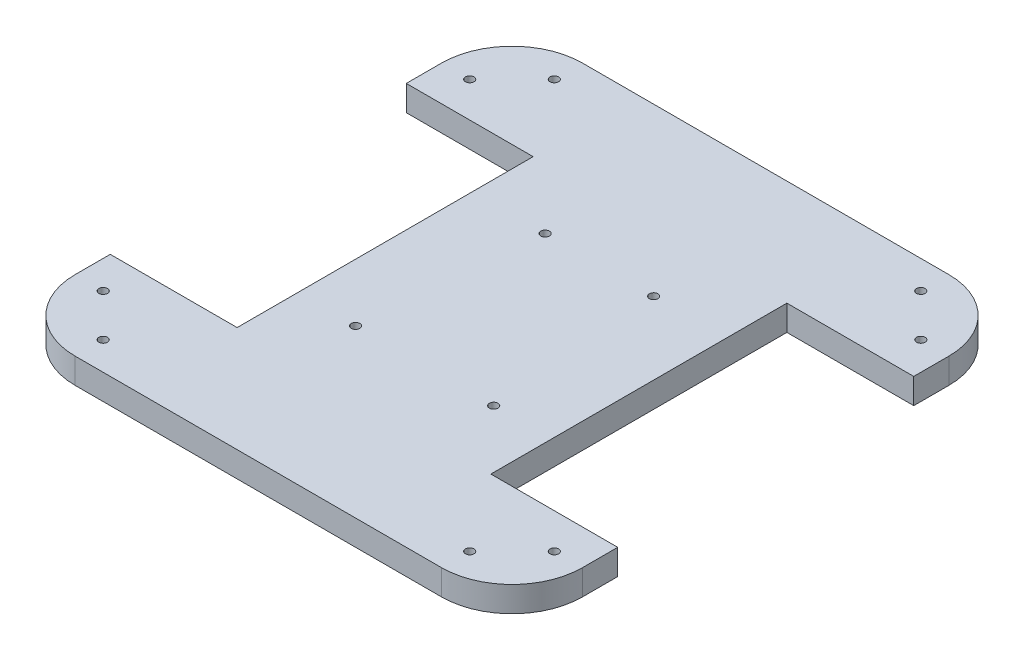
ISO-10303-21;
HEADER;
FILE_DESCRIPTION(('STEP AP214'),'2;1');
FILE_NAME('part.step','',(''),(''),'','','');
FILE_SCHEMA(('AUTOMOTIVE_DESIGN { 1 0 10303 214 1 1 1 1 }'));
ENDSEC;
DATA;
#1=APPLICATION_CONTEXT('core data for automotive mechanical design processes');
#2=APPLICATION_PROTOCOL_DEFINITION('international standard','automotive_design',2000,#1);
#3=PRODUCT_CONTEXT('',#1,'mechanical');
#4=PRODUCT('Part','Part','',(#3));
#5=PRODUCT_RELATED_PRODUCT_CATEGORY('part','',(#4));
#6=PRODUCT_DEFINITION_FORMATION('','',#4);
#7=PRODUCT_DEFINITION_CONTEXT('part definition',#1,'design');
#8=PRODUCT_DEFINITION('design','',#6,#7);
#9=PRODUCT_DEFINITION_SHAPE('','',#8);
#10=(LENGTH_UNIT() NAMED_UNIT(*) SI_UNIT(.MILLI.,.METRE.));
#11=(NAMED_UNIT(*) PLANE_ANGLE_UNIT() SI_UNIT($,.RADIAN.));
#12=(NAMED_UNIT(*) SI_UNIT($,.STERADIAN.) SOLID_ANGLE_UNIT());
#13=UNCERTAINTY_MEASURE_WITH_UNIT(LENGTH_MEASURE(1.E-05),#10,'distance_accuracy_value','');
#14=(GEOMETRIC_REPRESENTATION_CONTEXT(3) GLOBAL_UNCERTAINTY_ASSIGNED_CONTEXT((#13)) GLOBAL_UNIT_ASSIGNED_CONTEXT((#10,
#11,#12)) REPRESENTATION_CONTEXT('',''));
#15=CARTESIAN_POINT('',(0.,0.,0.));
#16=DIRECTION('',(0.,0.,1.));
#17=DIRECTION('',(1.,0.,0.));
#18=AXIS2_PLACEMENT_3D('',#15,#16,#17);
#19=CARTESIAN_POINT('',(-90.,9.,65.));
#20=DIRECTION('',(1.,0.,0.));
#21=DIRECTION('',(0.,0.,-1.));
#22=AXIS2_PLACEMENT_3D('',#19,#20,#21);
#23=PLANE('',#22);
#24=DIRECTION('',(0.,0.,1.));
#25=VECTOR('',#24,1.);
#26=CARTESIAN_POINT('',(-90.,0.,65.));
#27=LINE('',#26,#25);
#28=CARTESIAN_POINT('',(-90.,0.,-64.9999999999999));
#29=VERTEX_POINT('',#28);
#30=CARTESIAN_POINT('',(-90.,0.,-52.5));
#31=VERTEX_POINT('',#30);
#32=EDGE_CURVE('E177',#29,#31,#27,.T.);
#33=ORIENTED_EDGE('',*,*,#32,.T.);
#34=DIRECTION('',(0.,1.,0.));
#35=VECTOR('',#34,1.);
#36=CARTESIAN_POINT('',(-90.,0.,-52.5));
#37=LINE('',#36,#35);
#38=CARTESIAN_POINT('',(-90.,9.,-52.5));
#39=VERTEX_POINT('',#38);
#40=EDGE_CURVE('E227',#31,#39,#37,.T.);
#41=ORIENTED_EDGE('',*,*,#40,.T.);
#42=DIRECTION('',(0.,0.,1.));
#43=VECTOR('',#42,1.);
#44=CARTESIAN_POINT('',(-90.,9.,65.));
#45=LINE('',#44,#43);
#46=CARTESIAN_POINT('',(-90.,9.,-64.9999999999999));
#47=VERTEX_POINT('',#46);
#48=EDGE_CURVE('E229',#47,#39,#45,.T.);
#49=ORIENTED_EDGE('',*,*,#48,.F.);
#50=DIRECTION('',(0.,-1.,0.));
#51=VECTOR('',#50,1.);
#52=CARTESIAN_POINT('',(-90.,9.,-64.9999999999999));
#53=LINE('',#52,#51);
#54=EDGE_CURVE('E210',#47,#29,#53,.T.);
#55=ORIENTED_EDGE('',*,*,#54,.T.);
#56=EDGE_LOOP('',(#33,#41,#49,#55));
#57=FACE_BOUND('',#56,.T.);
#58=ADVANCED_FACE('F39',(#57),#23,.F.);
#59=CARTESIAN_POINT('',(90.,9.,65.));
#60=DIRECTION('',(-1.,0.,0.));
#61=DIRECTION('',(0.,0.,1.));
#62=AXIS2_PLACEMENT_3D('',#59,#60,#61);
#63=PLANE('',#62);
#64=DIRECTION('',(0.,0.,-1.));
#65=VECTOR('',#64,1.);
#66=CARTESIAN_POINT('',(90.,0.,65.));
#67=LINE('',#66,#65);
#68=CARTESIAN_POINT('',(90.,0.,65.));
#69=VERTEX_POINT('',#68);
#70=CARTESIAN_POINT('',(90.,0.,52.5));
#71=VERTEX_POINT('',#70);
#72=EDGE_CURVE('E191',#69,#71,#67,.T.);
#73=ORIENTED_EDGE('',*,*,#72,.T.);
#74=DIRECTION('',(0.,1.,0.));
#75=VECTOR('',#74,1.);
#76=CARTESIAN_POINT('',(90.,0.,52.5));
#77=LINE('',#76,#75);
#78=CARTESIAN_POINT('',(90.,9.,52.5));
#79=VERTEX_POINT('',#78);
#80=EDGE_CURVE('E276',#71,#79,#77,.T.);
#81=ORIENTED_EDGE('',*,*,#80,.T.);
#82=DIRECTION('',(0.,0.,-1.));
#83=VECTOR('',#82,1.);
#84=CARTESIAN_POINT('',(90.,9.,65.));
#85=LINE('',#84,#83);
#86=CARTESIAN_POINT('',(90.,9.,65.));
#87=VERTEX_POINT('',#86);
#88=EDGE_CURVE('E199',#87,#79,#85,.T.);
#89=ORIENTED_EDGE('',*,*,#88,.F.);
#90=DIRECTION('',(0.,-1.,0.));
#91=VECTOR('',#90,1.);
#92=CARTESIAN_POINT('',(90.,9.,65.));
#93=LINE('',#92,#91);
#94=EDGE_CURVE('E198',#87,#69,#93,.T.);
#95=ORIENTED_EDGE('',*,*,#94,.T.);
#96=EDGE_LOOP('',(#73,#81,#89,#95));
#97=FACE_BOUND('',#96,.T.);
#98=ADVANCED_FACE('F372',(#97),#63,.F.);
#99=CARTESIAN_POINT('',(64.9999999999998,9.,-64.9999999999999));
#100=DIRECTION('',(0.,-1.,0.));
#101=DIRECTION('',(0.,0.,-1.));
#102=AXIS2_PLACEMENT_3D('',#99,#100,#101);
#103=CYLINDRICAL_SURFACE('',#102,25.0000000000002);
#104=CARTESIAN_POINT('',(64.9999999999998,0.,-64.9999999999999));
#105=DIRECTION('',(0.,1.,0.));
#106=DIRECTION('',(0.,0.,-1.));
#107=AXIS2_PLACEMENT_3D('',#104,#105,#106);
#108=CIRCLE('',#107,25.0000000000002);
#109=CARTESIAN_POINT('',(90.,0.,-64.9999999999999));
#110=VERTEX_POINT('',#109);
#111=CARTESIAN_POINT('',(64.9999999999998,0.,-90.0000000000001));
#112=VERTEX_POINT('',#111);
#113=EDGE_CURVE('E245',#110,#112,#108,.T.);
#114=ORIENTED_EDGE('',*,*,#113,.T.);
#115=DIRECTION('',(0.,-1.,0.));
#116=VECTOR('',#115,1.);
#117=CARTESIAN_POINT('',(64.9999999999998,9.,-90.0000000000001));
#118=LINE('',#117,#116);
#119=CARTESIAN_POINT('',(64.9999999999998,9.,-90.0000000000001));
#120=VERTEX_POINT('',#119);
#121=EDGE_CURVE('E11',#120,#112,#118,.T.);
#122=ORIENTED_EDGE('',*,*,#121,.F.);
#123=CARTESIAN_POINT('',(64.9999999999998,9.,-64.9999999999999));
#124=DIRECTION('',(0.,1.,0.));
#125=DIRECTION('',(0.,0.,-1.));
#126=AXIS2_PLACEMENT_3D('',#123,#124,#125);
#127=CIRCLE('',#126,25.0000000000002);
#128=CARTESIAN_POINT('',(90.,9.,-64.9999999999999));
#129=VERTEX_POINT('',#128);
#130=EDGE_CURVE('E194',#129,#120,#127,.T.);
#131=ORIENTED_EDGE('',*,*,#130,.F.);
#132=DIRECTION('',(0.,-1.,0.));
#133=VECTOR('',#132,1.);
#134=CARTESIAN_POINT('',(90.,9.,-64.9999999999999));
#135=LINE('',#134,#133);
#136=EDGE_CURVE('E195',#129,#110,#135,.T.);
#137=ORIENTED_EDGE('',*,*,#136,.T.);
#138=EDGE_LOOP('',(#114,#122,#131,#137));
#139=FACE_BOUND('',#138,.T.);
#140=ADVANCED_FACE('F41',(#139),#103,.T.);
#141=CARTESIAN_POINT('',(-64.9999999999998,9.,-90.0000000000001));
#142=DIRECTION('',(0.,0.,1.));
#143=DIRECTION('',(1.,0.,0.));
#144=AXIS2_PLACEMENT_3D('',#141,#142,#143);
#145=PLANE('',#144);
#146=DIRECTION('',(-1.,0.,0.));
#147=VECTOR('',#146,1.);
#148=CARTESIAN_POINT('',(-64.9999999999998,0.,-90.0000000000001));
#149=LINE('',#148,#147);
#150=CARTESIAN_POINT('',(-64.9999999999998,0.,-90.0000000000001));
#151=VERTEX_POINT('',#150);
#152=EDGE_CURVE('E181',#112,#151,#149,.T.);
#153=ORIENTED_EDGE('',*,*,#152,.T.);
#154=DIRECTION('',(0.,-1.,0.));
#155=VECTOR('',#154,1.);
#156=CARTESIAN_POINT('',(-64.9999999999998,9.,-90.0000000000001));
#157=LINE('',#156,#155);
#158=CARTESIAN_POINT('',(-64.9999999999998,9.,-90.0000000000001));
#159=VERTEX_POINT('',#158);
#160=EDGE_CURVE('E47',#159,#151,#157,.T.);
#161=ORIENTED_EDGE('',*,*,#160,.F.);
#162=DIRECTION('',(-1.,0.,0.));
#163=VECTOR('',#162,1.);
#164=CARTESIAN_POINT('',(-64.9999999999998,9.,-90.0000000000001));
#165=LINE('',#164,#163);
#166=EDGE_CURVE('E250',#120,#159,#165,.T.);
#167=ORIENTED_EDGE('',*,*,#166,.F.);
#168=ORIENTED_EDGE('',*,*,#121,.T.);
#169=EDGE_LOOP('',(#153,#161,#167,#168));
#170=FACE_BOUND('',#169,.T.);
#171=ADVANCED_FACE('F248',(#170),#145,.F.);
#172=CARTESIAN_POINT('',(-64.9999999999998,9.,-64.9999999999999));
#173=DIRECTION('',(0.,-1.,0.));
#174=DIRECTION('',(0.,0.,-1.));
#175=AXIS2_PLACEMENT_3D('',#172,#173,#174);
#176=CYLINDRICAL_SURFACE('',#175,25.0000000000002);
#177=CARTESIAN_POINT('',(-64.9999999999998,0.,-64.9999999999999));
#178=DIRECTION('',(0.,1.,0.));
#179=DIRECTION('',(0.,0.,-1.));
#180=AXIS2_PLACEMENT_3D('',#177,#178,#179);
#181=CIRCLE('',#180,25.0000000000002);
#182=EDGE_CURVE('E178',#151,#29,#181,.T.);
#183=ORIENTED_EDGE('',*,*,#182,.T.);
#184=ORIENTED_EDGE('',*,*,#54,.F.);
#185=CARTESIAN_POINT('',(-64.9999999999998,9.,-64.9999999999999));
#186=DIRECTION('',(0.,1.,0.));
#187=DIRECTION('',(0.,0.,-1.));
#188=AXIS2_PLACEMENT_3D('',#185,#186,#187);
#189=CIRCLE('',#188,25.0000000000002);
#190=EDGE_CURVE('E219',#159,#47,#189,.T.);
#191=ORIENTED_EDGE('',*,*,#190,.F.);
#192=ORIENTED_EDGE('',*,*,#160,.T.);
#193=EDGE_LOOP('',(#183,#184,#191,#192));
#194=FACE_BOUND('',#193,.T.);
#195=ADVANCED_FACE('F217',(#194),#176,.T.);
#196=CARTESIAN_POINT('',(-90.,9.,52.5));
#197=VERTEX_POINT('',#196);
#198=CARTESIAN_POINT('',(-90.,9.,65.));
#199=VERTEX_POINT('',#198);
#200=EDGE_CURVE('E168',#197,#199,#45,.T.);
#201=ORIENTED_EDGE('',*,*,#200,.F.);
#202=DIRECTION('',(0.,1.,0.));
#203=VECTOR('',#202,1.);
#204=CARTESIAN_POINT('',(-90.,0.,52.5));
#205=LINE('',#204,#203);
#206=CARTESIAN_POINT('',(-90.,0.,52.5));
#207=VERTEX_POINT('',#206);
#208=EDGE_CURVE('E155',#207,#197,#205,.T.);
#209=ORIENTED_EDGE('',*,*,#208,.F.);
#210=CARTESIAN_POINT('',(-90.,0.,65.));
#211=VERTEX_POINT('',#210);
#212=EDGE_CURVE('E166',#207,#211,#27,.T.);
#213=ORIENTED_EDGE('',*,*,#212,.T.);
#214=DIRECTION('',(0.,-1.,0.));
#215=VECTOR('',#214,1.);
#216=CARTESIAN_POINT('',(-90.,9.,65.));
#217=LINE('',#216,#215);
#218=EDGE_CURVE('E208',#199,#211,#217,.T.);
#219=ORIENTED_EDGE('',*,*,#218,.F.);
#220=EDGE_LOOP('',(#201,#209,#213,#219));
#221=FACE_BOUND('',#220,.T.);
#222=ADVANCED_FACE('F164',(#221),#23,.F.);
#223=CARTESIAN_POINT('',(-65.,9.,65.));
#224=DIRECTION('',(0.,-1.,0.));
#225=DIRECTION('',(0.,0.,-1.));
#226=AXIS2_PLACEMENT_3D('',#223,#224,#225);
#227=CYLINDRICAL_SURFACE('',#226,25.);
#228=CARTESIAN_POINT('',(-65.,0.,65.));
#229=DIRECTION('',(0.,1.,0.));
#230=DIRECTION('',(0.,0.,-1.));
#231=AXIS2_PLACEMENT_3D('',#228,#229,#230);
#232=CIRCLE('',#231,25.);
#233=CARTESIAN_POINT('',(-64.9999999999998,0.,90.0000000000001));
#234=VERTEX_POINT('',#233);
#235=EDGE_CURVE('E176',#211,#234,#232,.T.);
#236=ORIENTED_EDGE('',*,*,#235,.T.);
#237=DIRECTION('',(0.,-1.,0.));
#238=VECTOR('',#237,1.);
#239=CARTESIAN_POINT('',(-64.9999999999998,9.,90.0000000000001));
#240=LINE('',#239,#238);
#241=CARTESIAN_POINT('',(-64.9999999999998,9.,90.0000000000001));
#242=VERTEX_POINT('',#241);
#243=EDGE_CURVE('E205',#242,#234,#240,.T.);
#244=ORIENTED_EDGE('',*,*,#243,.F.);
#245=CARTESIAN_POINT('',(-65.,9.,65.));
#246=DIRECTION('',(0.,1.,0.));
#247=DIRECTION('',(0.,0.,-1.));
#248=AXIS2_PLACEMENT_3D('',#245,#246,#247);
#249=CIRCLE('',#248,25.);
#250=EDGE_CURVE('E232',#199,#242,#249,.T.);
#251=ORIENTED_EDGE('',*,*,#250,.F.);
#252=ORIENTED_EDGE('',*,*,#218,.T.);
#253=EDGE_LOOP('',(#236,#244,#251,#252));
#254=FACE_BOUND('',#253,.T.);
#255=ADVANCED_FACE('F386',(#254),#227,.T.);
#256=CARTESIAN_POINT('',(-64.9999999999998,9.,90.0000000000001));
#257=DIRECTION('',(0.,0.,-1.));
#258=DIRECTION('',(-1.,0.,0.));
#259=AXIS2_PLACEMENT_3D('',#256,#257,#258);
#260=PLANE('',#259);
#261=DIRECTION('',(1.,0.,0.));
#262=VECTOR('',#261,1.);
#263=CARTESIAN_POINT('',(-64.9999999999998,0.,90.0000000000001));
#264=LINE('',#263,#262);
#265=CARTESIAN_POINT('',(64.9999999999998,0.,90.0000000000001));
#266=VERTEX_POINT('',#265);
#267=EDGE_CURVE('E186',#234,#266,#264,.T.);
#268=ORIENTED_EDGE('',*,*,#267,.T.);
#269=DIRECTION('',(0.,-1.,0.));
#270=VECTOR('',#269,1.);
#271=CARTESIAN_POINT('',(64.9999999999998,9.,90.0000000000001));
#272=LINE('',#271,#270);
#273=CARTESIAN_POINT('',(64.9999999999998,9.,90.0000000000001));
#274=VERTEX_POINT('',#273);
#275=EDGE_CURVE('E202',#274,#266,#272,.T.);
#276=ORIENTED_EDGE('',*,*,#275,.F.);
#277=DIRECTION('',(1.,0.,0.));
#278=VECTOR('',#277,1.);
#279=CARTESIAN_POINT('',(-64.9999999999998,9.,90.0000000000001));
#280=LINE('',#279,#278);
#281=EDGE_CURVE('E234',#242,#274,#280,.T.);
#282=ORIENTED_EDGE('',*,*,#281,.F.);
#283=ORIENTED_EDGE('',*,*,#243,.T.);
#284=EDGE_LOOP('',(#268,#276,#282,#283));
#285=FACE_BOUND('',#284,.T.);
#286=ADVANCED_FACE('F390',(#285),#260,.F.);
#287=CARTESIAN_POINT('',(65.,9.,65.));
#288=DIRECTION('',(0.,-1.,0.));
#289=DIRECTION('',(0.,0.,-1.));
#290=AXIS2_PLACEMENT_3D('',#287,#288,#289);
#291=CYLINDRICAL_SURFACE('',#290,25.);
#292=CARTESIAN_POINT('',(65.,0.,65.));
#293=DIRECTION('',(0.,1.,0.));
#294=DIRECTION('',(0.,0.,-1.));
#295=AXIS2_PLACEMENT_3D('',#292,#293,#294);
#296=CIRCLE('',#295,25.);
#297=EDGE_CURVE('E188',#266,#69,#296,.T.);
#298=ORIENTED_EDGE('',*,*,#297,.T.);
#299=ORIENTED_EDGE('',*,*,#94,.F.);
#300=CARTESIAN_POINT('',(65.,9.,65.));
#301=DIRECTION('',(0.,1.,0.));
#302=DIRECTION('',(0.,0.,-1.));
#303=AXIS2_PLACEMENT_3D('',#300,#301,#302);
#304=CIRCLE('',#303,25.);
#305=EDGE_CURVE('E240',#274,#87,#304,.T.);
#306=ORIENTED_EDGE('',*,*,#305,.F.);
#307=ORIENTED_EDGE('',*,*,#275,.T.);
#308=EDGE_LOOP('',(#298,#299,#306,#307));
#309=FACE_BOUND('',#308,.T.);
#310=ADVANCED_FACE('F370',(#309),#291,.T.);
#311=CARTESIAN_POINT('',(90.,9.,-52.5));
#312=VERTEX_POINT('',#311);
#313=EDGE_CURVE('E242',#312,#129,#85,.T.);
#314=ORIENTED_EDGE('',*,*,#313,.F.);
#315=DIRECTION('',(0.,1.,0.));
#316=VECTOR('',#315,1.);
#317=CARTESIAN_POINT('',(90.,0.,-52.5));
#318=LINE('',#317,#316);
#319=CARTESIAN_POINT('',(90.,0.,-52.5));
#320=VERTEX_POINT('',#319);
#321=EDGE_CURVE('E262',#320,#312,#318,.T.);
#322=ORIENTED_EDGE('',*,*,#321,.F.);
#323=EDGE_CURVE('E190',#320,#110,#67,.T.);
#324=ORIENTED_EDGE('',*,*,#323,.T.);
#325=ORIENTED_EDGE('',*,*,#136,.F.);
#326=EDGE_LOOP('',(#314,#322,#324,#325));
#327=FACE_BOUND('',#326,.T.);
#328=ADVANCED_FACE('F261',(#327),#63,.F.);
#329=CARTESIAN_POINT('',(64.9999999999998,9.,-64.9999999999999));
#330=DIRECTION('',(0.,-1.,0.));
#331=DIRECTION('',(0.,0.,-1.));
#332=AXIS2_PLACEMENT_3D('',#329,#330,#331);
#333=PLANE('',#332);
#334=CARTESIAN_POINT('',(-24.5,9.,31.0000000000001));
#335=DIRECTION('',(0.,1.,0.));
#336=DIRECTION('',(0.,0.,1.));
#337=AXIS2_PLACEMENT_3D('',#334,#335,#336);
#338=CIRCLE('',#337,1.525);
#339=CARTESIAN_POINT('',(-24.5,9.,32.5250000000001));
#340=VERTEX_POINT('',#339);
#341=EDGE_CURVE('E293',#340,#340,#338,.T.);
#342=ORIENTED_EDGE('',*,*,#341,.F.);
#343=EDGE_LOOP('',(#342));
#344=FACE_BOUND('',#343,.T.);
#345=CARTESIAN_POINT('',(19.25,9.,-30.9999999999999));
#346=DIRECTION('',(0.,1.,0.));
#347=DIRECTION('',(0.,0.,1.));
#348=AXIS2_PLACEMENT_3D('',#345,#346,#347);
#349=CIRCLE('',#348,1.525);
#350=CARTESIAN_POINT('',(19.25,9.,-29.4749999999999));
#351=VERTEX_POINT('',#350);
#352=EDGE_CURVE('E297',#351,#351,#349,.T.);
#353=ORIENTED_EDGE('',*,*,#352,.F.);
#354=EDGE_LOOP('',(#353));
#355=FACE_BOUND('',#354,.T.);
#356=CARTESIAN_POINT('',(-19.25,9.,-30.9999999999999));
#357=DIRECTION('',(0.,1.,0.));
#358=DIRECTION('',(0.,0.,1.));
#359=AXIS2_PLACEMENT_3D('',#356,#357,#358);
#360=CIRCLE('',#359,1.525);
#361=CARTESIAN_POINT('',(-19.25,9.,-29.4749999999999));
#362=VERTEX_POINT('',#361);
#363=EDGE_CURVE('E309',#362,#362,#360,.T.);
#364=ORIENTED_EDGE('',*,*,#363,.F.);
#365=EDGE_LOOP('',(#364));
#366=FACE_BOUND('',#365,.T.);
#367=CARTESIAN_POINT('',(24.5,9.,31.0000000000001));
#368=DIRECTION('',(0.,1.,0.));
#369=DIRECTION('',(0.,0.,1.));
#370=AXIS2_PLACEMENT_3D('',#367,#368,#369);
#371=CIRCLE('',#370,1.525);
#372=CARTESIAN_POINT('',(24.5,9.,32.5250000000001));
#373=VERTEX_POINT('',#372);
#374=EDGE_CURVE('E296',#373,#373,#371,.T.);
#375=ORIENTED_EDGE('',*,*,#374,.F.);
#376=EDGE_LOOP('',(#375));
#377=FACE_BOUND('',#376,.T.);
#378=CARTESIAN_POINT('',(64.9999999999998,9.,-79.9999999999999));
#379=DIRECTION('',(0.,1.,0.));
#380=DIRECTION('',(0.,0.,1.));
#381=AXIS2_PLACEMENT_3D('',#378,#379,#380);
#382=CIRCLE('',#381,1.525);
#383=CARTESIAN_POINT('',(64.9999999999998,9.,-78.4749999999999));
#384=VERTEX_POINT('',#383);
#385=EDGE_CURVE('E339',#384,#384,#382,.T.);
#386=ORIENTED_EDGE('',*,*,#385,.F.);
#387=EDGE_LOOP('',(#386));
#388=FACE_BOUND('',#387,.T.);
#389=CARTESIAN_POINT('',(79.9999999999998,9.,65.));
#390=DIRECTION('',(0.,1.,0.));
#391=DIRECTION('',(0.,0.,1.));
#392=AXIS2_PLACEMENT_3D('',#389,#390,#391);
#393=CIRCLE('',#392,1.525);
#394=CARTESIAN_POINT('',(79.9999999999998,9.,66.525));
#395=VERTEX_POINT('',#394);
#396=EDGE_CURVE('E332',#395,#395,#393,.T.);
#397=ORIENTED_EDGE('',*,*,#396,.F.);
#398=EDGE_LOOP('',(#397));
#399=FACE_BOUND('',#398,.T.);
#400=CARTESIAN_POINT('',(79.9999999999998,9.,-64.9999999999999));
#401=DIRECTION('',(0.,1.,0.));
#402=DIRECTION('',(0.,0.,1.));
#403=AXIS2_PLACEMENT_3D('',#400,#401,#402);
#404=CIRCLE('',#403,1.525);
#405=CARTESIAN_POINT('',(79.9999999999998,9.,-63.4749999999999));
#406=VERTEX_POINT('',#405);
#407=EDGE_CURVE('E351',#406,#406,#404,.T.);
#408=ORIENTED_EDGE('',*,*,#407,.F.);
#409=EDGE_LOOP('',(#408));
#410=FACE_BOUND('',#409,.T.);
#411=CARTESIAN_POINT('',(-79.9999999999998,9.,-64.9999999999999));
#412=DIRECTION('',(0.,1.,0.));
#413=DIRECTION('',(0.,0.,1.));
#414=AXIS2_PLACEMENT_3D('',#411,#412,#413);
#415=CIRCLE('',#414,1.525);
#416=CARTESIAN_POINT('',(-79.9999999999998,9.,-63.4749999999999));
#417=VERTEX_POINT('',#416);
#418=EDGE_CURVE('E344',#417,#417,#415,.T.);
#419=ORIENTED_EDGE('',*,*,#418,.F.);
#420=EDGE_LOOP('',(#419));
#421=FACE_BOUND('',#420,.T.);
#422=CARTESIAN_POINT('',(64.9999999999998,9.,80.));
#423=DIRECTION('',(0.,1.,0.));
#424=DIRECTION('',(0.,0.,1.));
#425=AXIS2_PLACEMENT_3D('',#422,#423,#424);
#426=CIRCLE('',#425,1.525);
#427=CARTESIAN_POINT('',(64.9999999999998,9.,81.525));
#428=VERTEX_POINT('',#427);
#429=EDGE_CURVE('E314',#428,#428,#426,.T.);
#430=ORIENTED_EDGE('',*,*,#429,.F.);
#431=EDGE_LOOP('',(#430));
#432=FACE_BOUND('',#431,.T.);
#433=CARTESIAN_POINT('',(-64.9999999999997,9.,80.));
#434=DIRECTION('',(0.,1.,0.));
#435=DIRECTION('',(0.,0.,1.));
#436=AXIS2_PLACEMENT_3D('',#433,#434,#435);
#437=CIRCLE('',#436,1.525);
#438=CARTESIAN_POINT('',(-64.9999999999997,9.,81.525));
#439=VERTEX_POINT('',#438);
#440=EDGE_CURVE('E321',#439,#439,#437,.T.);
#441=ORIENTED_EDGE('',*,*,#440,.F.);
#442=EDGE_LOOP('',(#441));
#443=FACE_BOUND('',#442,.T.);
#444=CARTESIAN_POINT('',(-79.9999999999997,9.,65.));
#445=DIRECTION('',(0.,1.,0.));
#446=DIRECTION('',(0.,0.,1.));
#447=AXIS2_PLACEMENT_3D('',#444,#445,#446);
#448=CIRCLE('',#447,1.525);
#449=CARTESIAN_POINT('',(-79.9999999999997,9.,66.525));
#450=VERTEX_POINT('',#449);
#451=EDGE_CURVE('E327',#450,#450,#448,.T.);
#452=ORIENTED_EDGE('',*,*,#451,.F.);
#453=EDGE_LOOP('',(#452));
#454=FACE_BOUND('',#453,.T.);
#455=CARTESIAN_POINT('',(-64.9999999999998,9.,-79.9999999999999));
#456=DIRECTION('',(0.,1.,0.));
#457=DIRECTION('',(0.,0.,1.));
#458=AXIS2_PLACEMENT_3D('',#455,#456,#457);
#459=CIRCLE('',#458,1.525);
#460=CARTESIAN_POINT('',(-64.9999999999998,9.,-78.4749999999999));
#461=VERTEX_POINT('',#460);
#462=EDGE_CURVE('E347',#461,#461,#459,.T.);
#463=ORIENTED_EDGE('',*,*,#462,.F.);
#464=EDGE_LOOP('',(#463));
#465=FACE_BOUND('',#464,.T.);
#466=ORIENTED_EDGE('',*,*,#48,.T.);
#467=DIRECTION('',(-1.,0.,0.));
#468=VECTOR('',#467,1.);
#469=CARTESIAN_POINT('',(-90.,9.,-52.5));
#470=LINE('',#469,#468);
#471=CARTESIAN_POINT('',(-45.,9.,-52.5));
#472=VERTEX_POINT('',#471);
#473=EDGE_CURVE('E160',#472,#39,#470,.T.);
#474=ORIENTED_EDGE('',*,*,#473,.F.);
#475=DIRECTION('',(0.,0.,-1.));
#476=VECTOR('',#475,1.);
#477=CARTESIAN_POINT('',(-45.,9.,-52.5));
#478=LINE('',#477,#476);
#479=CARTESIAN_POINT('',(-45.,9.,52.5));
#480=VERTEX_POINT('',#479);
#481=EDGE_CURVE('E640',#480,#472,#478,.T.);
#482=ORIENTED_EDGE('',*,*,#481,.F.);
#483=DIRECTION('',(1.,0.,0.));
#484=VECTOR('',#483,1.);
#485=CARTESIAN_POINT('',(-45.,9.,52.5));
#486=LINE('',#485,#484);
#487=EDGE_CURVE('E285',#197,#480,#486,.T.);
#488=ORIENTED_EDGE('',*,*,#487,.F.);
#489=ORIENTED_EDGE('',*,*,#200,.T.);
#490=ORIENTED_EDGE('',*,*,#250,.T.);
#491=ORIENTED_EDGE('',*,*,#281,.T.);
#492=ORIENTED_EDGE('',*,*,#305,.T.);
#493=ORIENTED_EDGE('',*,*,#88,.T.);
#494=DIRECTION('',(1.,0.,0.));
#495=VECTOR('',#494,1.);
#496=CARTESIAN_POINT('',(90.,9.,52.5));
#497=LINE('',#496,#495);
#498=CARTESIAN_POINT('',(45.,9.,52.5));
#499=VERTEX_POINT('',#498);
#500=EDGE_CURVE('E279',#499,#79,#497,.T.);
#501=ORIENTED_EDGE('',*,*,#500,.F.);
#502=DIRECTION('',(0.,0.,1.));
#503=VECTOR('',#502,1.);
#504=CARTESIAN_POINT('',(45.,9.,-52.5));
#505=LINE('',#504,#503);
#506=CARTESIAN_POINT('',(45.,9.,-52.5));
#507=VERTEX_POINT('',#506);
#508=EDGE_CURVE('E281',#507,#499,#505,.T.);
#509=ORIENTED_EDGE('',*,*,#508,.F.);
#510=DIRECTION('',(-1.,0.,0.));
#511=VECTOR('',#510,1.);
#512=CARTESIAN_POINT('',(90.,9.,-52.5));
#513=LINE('',#512,#511);
#514=EDGE_CURVE('E284',#312,#507,#513,.T.);
#515=ORIENTED_EDGE('',*,*,#514,.F.);
#516=ORIENTED_EDGE('',*,*,#313,.T.);
#517=ORIENTED_EDGE('',*,*,#130,.T.);
#518=ORIENTED_EDGE('',*,*,#166,.T.);
#519=ORIENTED_EDGE('',*,*,#190,.T.);
#520=EDGE_LOOP('',(#466,#474,#482,#488,#489,#490,#491,#492,#493,#501,#509,#515,#516,#517,#518,#519));
#521=FACE_BOUND('',#520,.T.);
#522=ADVANCED_FACE('F360',(#344,#355,#366,#377,#388,#399,#410,#421,#432,#443,#454,#465,#521),
#333,.F.);
#523=CARTESIAN_POINT('',(64.9999999999998,0.,-64.9999999999999));
#524=DIRECTION('',(0.,-1.,0.));
#525=DIRECTION('',(0.,0.,-1.));
#526=AXIS2_PLACEMENT_3D('',#523,#524,#525);
#527=PLANE('',#526);
#528=DIRECTION('',(-1.,0.,0.));
#529=VECTOR('',#528,1.);
#530=CARTESIAN_POINT('',(-90.,0.,-52.5));
#531=LINE('',#530,#529);
#532=CARTESIAN_POINT('',(-45.,0.,-52.5));
#533=VERTEX_POINT('',#532);
#534=EDGE_CURVE('E169',#533,#31,#531,.T.);
#535=ORIENTED_EDGE('',*,*,#534,.T.);
#536=ORIENTED_EDGE('',*,*,#32,.F.);
#537=ORIENTED_EDGE('',*,*,#182,.F.);
#538=ORIENTED_EDGE('',*,*,#152,.F.);
#539=ORIENTED_EDGE('',*,*,#113,.F.);
#540=ORIENTED_EDGE('',*,*,#323,.F.);
#541=DIRECTION('',(-1.,0.,0.));
#542=VECTOR('',#541,1.);
#543=CARTESIAN_POINT('',(90.,0.,-52.5));
#544=LINE('',#543,#542);
#545=CARTESIAN_POINT('',(45.,0.,-52.5));
#546=VERTEX_POINT('',#545);
#547=EDGE_CURVE('E257',#320,#546,#544,.T.);
#548=ORIENTED_EDGE('',*,*,#547,.T.);
#549=DIRECTION('',(0.,0.,1.));
#550=VECTOR('',#549,1.);
#551=CARTESIAN_POINT('',(45.,0.,-52.5));
#552=LINE('',#551,#550);
#553=CARTESIAN_POINT('',(45.,0.,52.5));
#554=VERTEX_POINT('',#553);
#555=EDGE_CURVE('E62',#546,#554,#552,.T.);
#556=ORIENTED_EDGE('',*,*,#555,.T.);
#557=DIRECTION('',(1.,0.,0.));
#558=VECTOR('',#557,1.);
#559=CARTESIAN_POINT('',(90.,0.,52.5));
#560=LINE('',#559,#558);
#561=EDGE_CURVE('E266',#554,#71,#560,.T.);
#562=ORIENTED_EDGE('',*,*,#561,.T.);
#563=ORIENTED_EDGE('',*,*,#72,.F.);
#564=ORIENTED_EDGE('',*,*,#297,.F.);
#565=ORIENTED_EDGE('',*,*,#267,.F.);
#566=ORIENTED_EDGE('',*,*,#235,.F.);
#567=ORIENTED_EDGE('',*,*,#212,.F.);
#568=DIRECTION('',(1.,0.,0.));
#569=VECTOR('',#568,1.);
#570=CARTESIAN_POINT('',(-45.,0.,52.5));
#571=LINE('',#570,#569);
#572=CARTESIAN_POINT('',(-45.,0.,52.5));
#573=VERTEX_POINT('',#572);
#574=EDGE_CURVE('E151',#207,#573,#571,.T.);
#575=ORIENTED_EDGE('',*,*,#574,.T.);
#576=DIRECTION('',(0.,0.,-1.));
#577=VECTOR('',#576,1.);
#578=CARTESIAN_POINT('',(-45.,0.,-52.5));
#579=LINE('',#578,#577);
#580=EDGE_CURVE('E54',#573,#533,#579,.T.);
#581=ORIENTED_EDGE('',*,*,#580,.T.);
#582=EDGE_LOOP('',(#535,#536,#537,#538,#539,#540,#548,#556,#562,#563,#564,#565,#566,#567,#575,#581));
#583=FACE_BOUND('',#582,.T.);
#584=CARTESIAN_POINT('',(-24.5,0.,31.0000000000001));
#585=DIRECTION('',(0.,1.,0.));
#586=DIRECTION('',(0.,0.,1.));
#587=AXIS2_PLACEMENT_3D('',#584,#585,#586);
#588=CIRCLE('',#587,1.525);
#589=CARTESIAN_POINT('',(-24.5,0.,32.5250000000001));
#590=VERTEX_POINT('',#589);
#591=EDGE_CURVE('E289',#590,#590,#588,.T.);
#592=ORIENTED_EDGE('',*,*,#591,.T.);
#593=EDGE_LOOP('',(#592));
#594=FACE_BOUND('',#593,.T.);
#595=CARTESIAN_POINT('',(19.25,0.,-30.9999999999999));
#596=DIRECTION('',(0.,1.,0.));
#597=DIRECTION('',(0.,0.,1.));
#598=AXIS2_PLACEMENT_3D('',#595,#596,#597);
#599=CIRCLE('',#598,1.525);
#600=CARTESIAN_POINT('',(19.25,0.,-29.4749999999999));
#601=VERTEX_POINT('',#600);
#602=EDGE_CURVE('E301',#601,#601,#599,.T.);
#603=ORIENTED_EDGE('',*,*,#602,.T.);
#604=EDGE_LOOP('',(#603));
#605=FACE_BOUND('',#604,.T.);
#606=CARTESIAN_POINT('',(-19.25,0.,-30.9999999999999));
#607=DIRECTION('',(0.,1.,0.));
#608=DIRECTION('',(0.,0.,1.));
#609=AXIS2_PLACEMENT_3D('',#606,#607,#608);
#610=CIRCLE('',#609,1.525);
#611=CARTESIAN_POINT('',(-19.25,0.,-29.4749999999999));
#612=VERTEX_POINT('',#611);
#613=EDGE_CURVE('E300',#612,#612,#610,.T.);
#614=ORIENTED_EDGE('',*,*,#613,.T.);
#615=EDGE_LOOP('',(#614));
#616=FACE_BOUND('',#615,.T.);
#617=CARTESIAN_POINT('',(24.5,0.,31.0000000000001));
#618=DIRECTION('',(0.,1.,0.));
#619=DIRECTION('',(0.,0.,1.));
#620=AXIS2_PLACEMENT_3D('',#617,#618,#619);
#621=CIRCLE('',#620,1.525);
#622=CARTESIAN_POINT('',(24.5,0.,32.5250000000001));
#623=VERTEX_POINT('',#622);
#624=EDGE_CURVE('E306',#623,#623,#621,.T.);
#625=ORIENTED_EDGE('',*,*,#624,.T.);
#626=EDGE_LOOP('',(#625));
#627=FACE_BOUND('',#626,.T.);
#628=CARTESIAN_POINT('',(64.9999999999998,0.,-79.9999999999999));
#629=DIRECTION('',(0.,1.,0.));
#630=DIRECTION('',(0.,0.,1.));
#631=AXIS2_PLACEMENT_3D('',#628,#629,#630);
#632=CIRCLE('',#631,1.525);
#633=CARTESIAN_POINT('',(64.9999999999998,0.,-78.4749999999999));
#634=VERTEX_POINT('',#633);
#635=EDGE_CURVE('E317',#634,#634,#632,.T.);
#636=ORIENTED_EDGE('',*,*,#635,.T.);
#637=EDGE_LOOP('',(#636));
#638=FACE_BOUND('',#637,.T.);
#639=CARTESIAN_POINT('',(79.9999999999998,0.,65.));
#640=DIRECTION('',(0.,1.,0.));
#641=DIRECTION('',(0.,0.,1.));
#642=AXIS2_PLACEMENT_3D('',#639,#640,#641);
#643=CIRCLE('',#642,1.525);
#644=CARTESIAN_POINT('',(79.9999999999998,0.,66.525));
#645=VERTEX_POINT('',#644);
#646=EDGE_CURVE('E336',#645,#645,#643,.T.);
#647=ORIENTED_EDGE('',*,*,#646,.T.);
#648=EDGE_LOOP('',(#647));
#649=FACE_BOUND('',#648,.T.);
#650=CARTESIAN_POINT('',(79.9999999999998,0.,-64.9999999999999));
#651=DIRECTION('',(0.,1.,0.));
#652=DIRECTION('',(0.,0.,1.));
#653=AXIS2_PLACEMENT_3D('',#650,#651,#652);
#654=CIRCLE('',#653,1.525);
#655=CARTESIAN_POINT('',(79.9999999999998,0.,-63.4749999999999));
#656=VERTEX_POINT('',#655);
#657=EDGE_CURVE('E335',#656,#656,#654,.T.);
#658=ORIENTED_EDGE('',*,*,#657,.T.);
#659=EDGE_LOOP('',(#658));
#660=FACE_BOUND('',#659,.T.);
#661=CARTESIAN_POINT('',(-79.9999999999998,0.,-64.9999999999999));
#662=DIRECTION('',(0.,1.,0.));
#663=DIRECTION('',(0.,0.,1.));
#664=AXIS2_PLACEMENT_3D('',#661,#662,#663);
#665=CIRCLE('',#664,1.525);
#666=CARTESIAN_POINT('',(-79.9999999999998,0.,-63.4749999999999));
#667=VERTEX_POINT('',#666);
#668=EDGE_CURVE('E348',#667,#667,#665,.T.);
#669=ORIENTED_EDGE('',*,*,#668,.T.);
#670=EDGE_LOOP('',(#669));
#671=FACE_BOUND('',#670,.T.);
#672=CARTESIAN_POINT('',(64.9999999999998,0.,80.));
#673=DIRECTION('',(0.,1.,0.));
#674=DIRECTION('',(0.,0.,1.));
#675=AXIS2_PLACEMENT_3D('',#672,#673,#674);
#676=CIRCLE('',#675,1.525);
#677=CARTESIAN_POINT('',(64.9999999999998,0.,81.525));
#678=VERTEX_POINT('',#677);
#679=EDGE_CURVE('E318',#678,#678,#676,.T.);
#680=ORIENTED_EDGE('',*,*,#679,.T.);
#681=EDGE_LOOP('',(#680));
#682=FACE_BOUND('',#681,.T.);
#683=CARTESIAN_POINT('',(-64.9999999999997,0.,80.));
#684=DIRECTION('',(0.,1.,0.));
#685=DIRECTION('',(0.,0.,1.));
#686=AXIS2_PLACEMENT_3D('',#683,#684,#685);
#687=CIRCLE('',#686,1.525);
#688=CARTESIAN_POINT('',(-64.9999999999997,0.,81.525));
#689=VERTEX_POINT('',#688);
#690=EDGE_CURVE('E324',#689,#689,#687,.T.);
#691=ORIENTED_EDGE('',*,*,#690,.T.);
#692=EDGE_LOOP('',(#691));
#693=FACE_BOUND('',#692,.T.);
#694=CARTESIAN_POINT('',(-79.9999999999997,0.,65.));
#695=DIRECTION('',(0.,1.,0.));
#696=DIRECTION('',(0.,0.,1.));
#697=AXIS2_PLACEMENT_3D('',#694,#695,#696);
#698=CIRCLE('',#697,1.525);
#699=CARTESIAN_POINT('',(-79.9999999999997,0.,66.525));
#700=VERTEX_POINT('',#699);
#701=EDGE_CURVE('E292',#700,#700,#698,.T.);
#702=ORIENTED_EDGE('',*,*,#701,.T.);
#703=EDGE_LOOP('',(#702));
#704=FACE_BOUND('',#703,.T.);
#705=CARTESIAN_POINT('',(-64.9999999999998,0.,-79.9999999999999));
#706=DIRECTION('',(0.,1.,0.));
#707=DIRECTION('',(0.,0.,1.));
#708=AXIS2_PLACEMENT_3D('',#705,#706,#707);
#709=CIRCLE('',#708,1.525);
#710=CARTESIAN_POINT('',(-64.9999999999998,0.,-78.4749999999999));
#711=VERTEX_POINT('',#710);
#712=EDGE_CURVE('E247',#711,#711,#709,.T.);
#713=ORIENTED_EDGE('',*,*,#712,.T.);
#714=EDGE_LOOP('',(#713));
#715=FACE_BOUND('',#714,.T.);
#716=ADVANCED_FACE('F173',(#583,#594,#605,#616,#627,#638,#649,#660,#671,#682,#693,#704,#715),
#527,.T.);
#717=CARTESIAN_POINT('',(-64.9999999999998,0.,-79.9999999999999));
#718=DIRECTION('',(0.,1.,0.));
#719=DIRECTION('',(0.,0.,1.));
#720=AXIS2_PLACEMENT_3D('',#717,#718,#719);
#721=CYLINDRICAL_SURFACE('',#720,1.525);
#722=ORIENTED_EDGE('',*,*,#712,.F.);
#723=EDGE_LOOP('',(#722));
#724=FACE_BOUND('',#723,.T.);
#725=ORIENTED_EDGE('',*,*,#462,.T.);
#726=EDGE_LOOP('',(#725));
#727=FACE_BOUND('',#726,.T.);
#728=ADVANCED_FACE('F368',(#724,#727),#721,.F.);
#729=CARTESIAN_POINT('',(-79.9999999999997,0.,65.));
#730=DIRECTION('',(0.,1.,0.));
#731=DIRECTION('',(0.,0.,1.));
#732=AXIS2_PLACEMENT_3D('',#729,#730,#731);
#733=CYLINDRICAL_SURFACE('',#732,1.525);
#734=ORIENTED_EDGE('',*,*,#701,.F.);
#735=EDGE_LOOP('',(#734));
#736=FACE_BOUND('',#735,.T.);
#737=ORIENTED_EDGE('',*,*,#451,.T.);
#738=EDGE_LOOP('',(#737));
#739=FACE_BOUND('',#738,.T.);
#740=ADVANCED_FACE('F464',(#736,#739),#733,.F.);
#741=CARTESIAN_POINT('',(-64.9999999999997,0.,80.));
#742=DIRECTION('',(0.,1.,0.));
#743=DIRECTION('',(0.,0.,1.));
#744=AXIS2_PLACEMENT_3D('',#741,#742,#743);
#745=CYLINDRICAL_SURFACE('',#744,1.525);
#746=ORIENTED_EDGE('',*,*,#690,.F.);
#747=EDGE_LOOP('',(#746));
#748=FACE_BOUND('',#747,.T.);
#749=ORIENTED_EDGE('',*,*,#440,.T.);
#750=EDGE_LOOP('',(#749));
#751=FACE_BOUND('',#750,.T.);
#752=ADVANCED_FACE('F473',(#748,#751),#745,.F.);
#753=CARTESIAN_POINT('',(64.9999999999998,0.,80.));
#754=DIRECTION('',(0.,1.,0.));
#755=DIRECTION('',(0.,0.,1.));
#756=AXIS2_PLACEMENT_3D('',#753,#754,#755);
#757=CYLINDRICAL_SURFACE('',#756,1.525);
#758=ORIENTED_EDGE('',*,*,#679,.F.);
#759=EDGE_LOOP('',(#758));
#760=FACE_BOUND('',#759,.T.);
#761=ORIENTED_EDGE('',*,*,#429,.T.);
#762=EDGE_LOOP('',(#761));
#763=FACE_BOUND('',#762,.T.);
#764=ADVANCED_FACE('F483',(#760,#763),#757,.F.);
#765=CARTESIAN_POINT('',(-79.9999999999998,0.,-64.9999999999999));
#766=DIRECTION('',(0.,1.,0.));
#767=DIRECTION('',(0.,0.,1.));
#768=AXIS2_PLACEMENT_3D('',#765,#766,#767);
#769=CYLINDRICAL_SURFACE('',#768,1.525);
#770=ORIENTED_EDGE('',*,*,#668,.F.);
#771=EDGE_LOOP('',(#770));
#772=FACE_BOUND('',#771,.T.);
#773=ORIENTED_EDGE('',*,*,#418,.T.);
#774=EDGE_LOOP('',(#773));
#775=FACE_BOUND('',#774,.T.);
#776=ADVANCED_FACE('F493',(#772,#775),#769,.F.);
#777=CARTESIAN_POINT('',(79.9999999999998,0.,-64.9999999999999));
#778=DIRECTION('',(0.,1.,0.));
#779=DIRECTION('',(0.,0.,1.));
#780=AXIS2_PLACEMENT_3D('',#777,#778,#779);
#781=CYLINDRICAL_SURFACE('',#780,1.525);
#782=ORIENTED_EDGE('',*,*,#657,.F.);
#783=EDGE_LOOP('',(#782));
#784=FACE_BOUND('',#783,.T.);
#785=ORIENTED_EDGE('',*,*,#407,.T.);
#786=EDGE_LOOP('',(#785));
#787=FACE_BOUND('',#786,.T.);
#788=ADVANCED_FACE('F503',(#784,#787),#781,.F.);
#789=CARTESIAN_POINT('',(79.9999999999998,0.,65.));
#790=DIRECTION('',(0.,1.,0.));
#791=DIRECTION('',(0.,0.,1.));
#792=AXIS2_PLACEMENT_3D('',#789,#790,#791);
#793=CYLINDRICAL_SURFACE('',#792,1.525);
#794=ORIENTED_EDGE('',*,*,#646,.F.);
#795=EDGE_LOOP('',(#794));
#796=FACE_BOUND('',#795,.T.);
#797=ORIENTED_EDGE('',*,*,#396,.T.);
#798=EDGE_LOOP('',(#797));
#799=FACE_BOUND('',#798,.T.);
#800=ADVANCED_FACE('F513',(#796,#799),#793,.F.);
#801=CARTESIAN_POINT('',(64.9999999999998,0.,-79.9999999999999));
#802=DIRECTION('',(0.,1.,0.));
#803=DIRECTION('',(0.,0.,1.));
#804=AXIS2_PLACEMENT_3D('',#801,#802,#803);
#805=CYLINDRICAL_SURFACE('',#804,1.525);
#806=ORIENTED_EDGE('',*,*,#635,.F.);
#807=EDGE_LOOP('',(#806));
#808=FACE_BOUND('',#807,.T.);
#809=ORIENTED_EDGE('',*,*,#385,.T.);
#810=EDGE_LOOP('',(#809));
#811=FACE_BOUND('',#810,.T.);
#812=ADVANCED_FACE('F523',(#808,#811),#805,.F.);
#813=CARTESIAN_POINT('',(24.5,0.,31.0000000000001));
#814=DIRECTION('',(0.,1.,0.));
#815=DIRECTION('',(0.,0.,1.));
#816=AXIS2_PLACEMENT_3D('',#813,#814,#815);
#817=CYLINDRICAL_SURFACE('',#816,1.525);
#818=ORIENTED_EDGE('',*,*,#624,.F.);
#819=EDGE_LOOP('',(#818));
#820=FACE_BOUND('',#819,.T.);
#821=ORIENTED_EDGE('',*,*,#374,.T.);
#822=EDGE_LOOP('',(#821));
#823=FACE_BOUND('',#822,.T.);
#824=ADVANCED_FACE('F533',(#820,#823),#817,.F.);
#825=CARTESIAN_POINT('',(-19.25,0.,-30.9999999999999));
#826=DIRECTION('',(0.,1.,0.));
#827=DIRECTION('',(0.,0.,1.));
#828=AXIS2_PLACEMENT_3D('',#825,#826,#827);
#829=CYLINDRICAL_SURFACE('',#828,1.525);
#830=ORIENTED_EDGE('',*,*,#613,.F.);
#831=EDGE_LOOP('',(#830));
#832=FACE_BOUND('',#831,.T.);
#833=ORIENTED_EDGE('',*,*,#363,.T.);
#834=EDGE_LOOP('',(#833));
#835=FACE_BOUND('',#834,.T.);
#836=ADVANCED_FACE('F543',(#832,#835),#829,.F.);
#837=CARTESIAN_POINT('',(19.25,0.,-30.9999999999999));
#838=DIRECTION('',(0.,1.,0.));
#839=DIRECTION('',(0.,0.,1.));
#840=AXIS2_PLACEMENT_3D('',#837,#838,#839);
#841=CYLINDRICAL_SURFACE('',#840,1.525);
#842=ORIENTED_EDGE('',*,*,#602,.F.);
#843=EDGE_LOOP('',(#842));
#844=FACE_BOUND('',#843,.T.);
#845=ORIENTED_EDGE('',*,*,#352,.T.);
#846=EDGE_LOOP('',(#845));
#847=FACE_BOUND('',#846,.T.);
#848=ADVANCED_FACE('F553',(#844,#847),#841,.F.);
#849=CARTESIAN_POINT('',(-24.5,0.,31.0000000000001));
#850=DIRECTION('',(0.,1.,0.));
#851=DIRECTION('',(0.,0.,1.));
#852=AXIS2_PLACEMENT_3D('',#849,#850,#851);
#853=CYLINDRICAL_SURFACE('',#852,1.525);
#854=ORIENTED_EDGE('',*,*,#591,.F.);
#855=EDGE_LOOP('',(#854));
#856=FACE_BOUND('',#855,.T.);
#857=ORIENTED_EDGE('',*,*,#341,.T.);
#858=EDGE_LOOP('',(#857));
#859=FACE_BOUND('',#858,.T.);
#860=ADVANCED_FACE('F563',(#856,#859),#853,.F.);
#861=CARTESIAN_POINT('',(90.,0.,52.5));
#862=DIRECTION('',(0.,0.,1.));
#863=DIRECTION('',(1.,0.,0.));
#864=AXIS2_PLACEMENT_3D('',#861,#862,#863);
#865=PLANE('',#864);
#866=ORIENTED_EDGE('',*,*,#500,.T.);
#867=ORIENTED_EDGE('',*,*,#80,.F.);
#868=ORIENTED_EDGE('',*,*,#561,.F.);
#869=DIRECTION('',(0.,1.,0.));
#870=VECTOR('',#869,1.);
#871=CARTESIAN_POINT('',(45.,0.,52.5));
#872=LINE('',#871,#870);
#873=EDGE_CURVE('E271',#554,#499,#872,.T.);
#874=ORIENTED_EDGE('',*,*,#873,.T.);
#875=EDGE_LOOP('',(#866,#867,#868,#874));
#876=FACE_BOUND('',#875,.T.);
#877=ADVANCED_FACE('F572',(#876),#865,.F.);
#878=CARTESIAN_POINT('',(45.,0.,-52.5));
#879=DIRECTION('',(-1.,0.,0.));
#880=DIRECTION('',(0.,0.,1.));
#881=AXIS2_PLACEMENT_3D('',#878,#879,#880);
#882=PLANE('',#881);
#883=ORIENTED_EDGE('',*,*,#508,.T.);
#884=ORIENTED_EDGE('',*,*,#873,.F.);
#885=ORIENTED_EDGE('',*,*,#555,.F.);
#886=DIRECTION('',(0.,1.,0.));
#887=VECTOR('',#886,1.);
#888=CARTESIAN_POINT('',(45.,0.,-52.5));
#889=LINE('',#888,#887);
#890=EDGE_CURVE('E267',#546,#507,#889,.T.);
#891=ORIENTED_EDGE('',*,*,#890,.T.);
#892=EDGE_LOOP('',(#883,#884,#885,#891));
#893=FACE_BOUND('',#892,.T.);
#894=ADVANCED_FACE('F590',(#893),#882,.F.);
#895=CARTESIAN_POINT('',(90.,0.,-52.5));
#896=DIRECTION('',(0.,0.,-1.));
#897=DIRECTION('',(-1.,0.,0.));
#898=AXIS2_PLACEMENT_3D('',#895,#896,#897);
#899=PLANE('',#898);
#900=ORIENTED_EDGE('',*,*,#514,.T.);
#901=ORIENTED_EDGE('',*,*,#890,.F.);
#902=ORIENTED_EDGE('',*,*,#547,.F.);
#903=ORIENTED_EDGE('',*,*,#321,.T.);
#904=EDGE_LOOP('',(#900,#901,#902,#903));
#905=FACE_BOUND('',#904,.T.);
#906=ADVANCED_FACE('F600',(#905),#899,.F.);
#907=CARTESIAN_POINT('',(-90.,0.,-52.5));
#908=DIRECTION('',(0.,0.,-1.));
#909=DIRECTION('',(-1.,0.,0.));
#910=AXIS2_PLACEMENT_3D('',#907,#908,#909);
#911=PLANE('',#910);
#912=ORIENTED_EDGE('',*,*,#473,.T.);
#913=ORIENTED_EDGE('',*,*,#40,.F.);
#914=ORIENTED_EDGE('',*,*,#534,.F.);
#915=DIRECTION('',(0.,1.,0.));
#916=VECTOR('',#915,1.);
#917=CARTESIAN_POINT('',(-45.,0.,-52.5));
#918=LINE('',#917,#916);
#919=EDGE_CURVE('E641',#533,#472,#918,.T.);
#920=ORIENTED_EDGE('',*,*,#919,.T.);
#921=EDGE_LOOP('',(#912,#913,#914,#920));
#922=FACE_BOUND('',#921,.T.);
#923=ADVANCED_FACE('F609',(#922),#911,.F.);
#924=CARTESIAN_POINT('',(-45.,0.,-52.5));
#925=DIRECTION('',(1.,0.,0.));
#926=DIRECTION('',(0.,0.,-1.));
#927=AXIS2_PLACEMENT_3D('',#924,#925,#926);
#928=PLANE('',#927);
#929=ORIENTED_EDGE('',*,*,#481,.T.);
#930=ORIENTED_EDGE('',*,*,#919,.F.);
#931=ORIENTED_EDGE('',*,*,#580,.F.);
#932=DIRECTION('',(0.,1.,0.));
#933=VECTOR('',#932,1.);
#934=CARTESIAN_POINT('',(-45.,0.,52.5));
#935=LINE('',#934,#933);
#936=EDGE_CURVE('E157',#573,#480,#935,.T.);
#937=ORIENTED_EDGE('',*,*,#936,.T.);
#938=EDGE_LOOP('',(#929,#930,#931,#937));
#939=FACE_BOUND('',#938,.T.);
#940=ADVANCED_FACE('F618',(#939),#928,.F.);
#941=CARTESIAN_POINT('',(-45.,0.,52.5));
#942=DIRECTION('',(0.,0.,1.));
#943=DIRECTION('',(1.,0.,0.));
#944=AXIS2_PLACEMENT_3D('',#941,#942,#943);
#945=PLANE('',#944);
#946=ORIENTED_EDGE('',*,*,#487,.T.);
#947=ORIENTED_EDGE('',*,*,#936,.F.);
#948=ORIENTED_EDGE('',*,*,#574,.F.);
#949=ORIENTED_EDGE('',*,*,#208,.T.);
#950=EDGE_LOOP('',(#946,#947,#948,#949));
#951=FACE_BOUND('',#950,.T.);
#952=ADVANCED_FACE('F154',(#951),#945,.F.);
#953=CLOSED_SHELL('',(#58,#98,#140,#171,#195,#222,#255,#286,#310,#328,#522,#716,#728,#740,#752,
#764,#776,#788,#800,#812,#824,#836,#848,#860,#877,#894,#906,#923,#940,#952));
#954=MANIFOLD_SOLID_BREP('B2',#953);
#955=ADVANCED_BREP_SHAPE_REPRESENTATION('',(#18,#954),#14);
#956=SHAPE_DEFINITION_REPRESENTATION(#9,#955);
ENDSEC;
END-ISO-10303-21;
